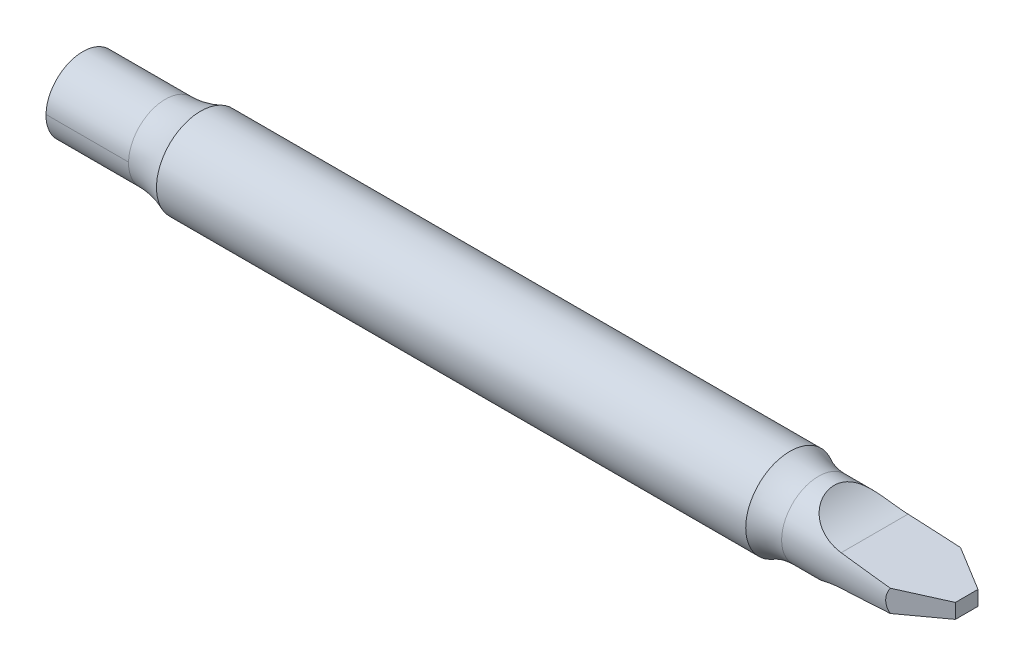
ISO-10303-21;
HEADER;
FILE_DESCRIPTION(('STEP AP214'),'2;1');
FILE_NAME('part.step','',(''),(''),'','','');
FILE_SCHEMA(('AUTOMOTIVE_DESIGN { 1 0 10303 214 1 1 1 1 }'));
ENDSEC;
DATA;
#1=APPLICATION_CONTEXT('core data for automotive mechanical design processes');
#2=APPLICATION_PROTOCOL_DEFINITION('international standard','automotive_design',2000,#1);
#3=PRODUCT_CONTEXT('',#1,'mechanical');
#4=PRODUCT('Part','Part','',(#3));
#5=PRODUCT_RELATED_PRODUCT_CATEGORY('part','',(#4));
#6=PRODUCT_DEFINITION_FORMATION('','',#4);
#7=PRODUCT_DEFINITION_CONTEXT('part definition',#1,'design');
#8=PRODUCT_DEFINITION('design','',#6,#7);
#9=PRODUCT_DEFINITION_SHAPE('','',#8);
#10=(LENGTH_UNIT() NAMED_UNIT(*) SI_UNIT(.MILLI.,.METRE.));
#11=(NAMED_UNIT(*) PLANE_ANGLE_UNIT() SI_UNIT($,.RADIAN.));
#12=(NAMED_UNIT(*) SI_UNIT($,.STERADIAN.) SOLID_ANGLE_UNIT());
#13=UNCERTAINTY_MEASURE_WITH_UNIT(LENGTH_MEASURE(1.E-05),#10,'distance_accuracy_value','');
#14=(GEOMETRIC_REPRESENTATION_CONTEXT(3) GLOBAL_UNCERTAINTY_ASSIGNED_CONTEXT((#13)) GLOBAL_UNIT_ASSIGNED_CONTEXT((#10,
#11,#12)) REPRESENTATION_CONTEXT('',''));
#15=CARTESIAN_POINT('',(0.,0.,0.));
#16=DIRECTION('',(0.,0.,1.));
#17=DIRECTION('',(1.,0.,0.));
#18=AXIS2_PLACEMENT_3D('',#15,#16,#17);
#19=CARTESIAN_POINT('',(50.8,0.,0.));
#20=DIRECTION('',(-1.,0.,0.));
#21=DIRECTION('',(0.,0.,1.));
#22=AXIS2_PLACEMENT_3D('',#19,#20,#21);
#23=CYLINDRICAL_SURFACE('',#22,15.875);
#24=CARTESIAN_POINT('',(35.5732349134821,0.,0.));
#25=DIRECTION('',(1.,0.,0.));
#26=DIRECTION('',(0.,0.,-1.));
#27=AXIS2_PLACEMENT_3D('',#24,#25,#26);
#28=CIRCLE('',#27,15.875);
#29=CARTESIAN_POINT('',(35.5732349134821,-0.333708294052789,-15.8714921722717));
#30=VERTEX_POINT('',#29);
#31=CARTESIAN_POINT('',(35.5732349134821,0.333708294052789,15.8714921722717));
#32=VERTEX_POINT('',#31);
#33=EDGE_CURVE('E336',#30,#32,#28,.F.);
#34=ORIENTED_EDGE('',*,*,#33,.T.);
#35=DIRECTION('',(-1.,0.,0.));
#36=VECTOR('',#35,1.);
#37=CARTESIAN_POINT('',(50.8,0.333708294052789,15.8714921722717));
#38=LINE('',#37,#36);
#39=CARTESIAN_POINT('',(0.,0.333708294052789,15.8714921722717));
#40=VERTEX_POINT('',#39);
#41=EDGE_CURVE('E11',#32,#40,#38,.T.);
#42=ORIENTED_EDGE('',*,*,#41,.T.);
#43=CARTESIAN_POINT('',(0.,0.,0.));
#44=DIRECTION('',(1.,0.,0.));
#45=DIRECTION('',(0.,0.,-1.));
#46=AXIS2_PLACEMENT_3D('',#43,#44,#45);
#47=CIRCLE('',#46,15.875);
#48=CARTESIAN_POINT('',(0.,-0.333708294052789,-15.8714921722717));
#49=VERTEX_POINT('',#48);
#50=EDGE_CURVE('E324',#40,#49,#47,.T.);
#51=ORIENTED_EDGE('',*,*,#50,.T.);
#52=DIRECTION('',(1.,0.,0.));
#53=VECTOR('',#52,1.);
#54=CARTESIAN_POINT('',(50.8,-0.333708294052789,-15.8714921722717));
#55=LINE('',#54,#53);
#56=EDGE_CURVE('E50',#49,#30,#55,.T.);
#57=ORIENTED_EDGE('',*,*,#56,.T.);
#58=EDGE_LOOP('',(#34,#42,#51,#57));
#59=FACE_BOUND('',#58,.T.);
#60=ADVANCED_FACE('F41',(#59),#23,.T.);
#61=CARTESIAN_POINT('',(381.,0.,0.));
#62=DIRECTION('',(-1.,0.,0.));
#63=DIRECTION('',(0.,0.,1.));
#64=AXIS2_PLACEMENT_3D('',#61,#62,#63);
#65=CYLINDRICAL_SURFACE('',#64,15.875);
#66=CARTESIAN_POINT('',(317.096722124209,0.,0.));
#67=DIRECTION('',(-1.,0.,0.));
#68=DIRECTION('',(0.,0.,1.));
#69=AXIS2_PLACEMENT_3D('',#66,#67,#68);
#70=CIRCLE('',#69,15.875);
#71=CARTESIAN_POINT('',(317.096722124209,0.,15.875));
#72=VERTEX_POINT('',#71);
#73=EDGE_CURVE('E332',#72,#72,#70,.F.);
#74=ORIENTED_EDGE('',*,*,#73,.T.);
#75=EDGE_LOOP('',(#74));
#76=FACE_BOUND('',#75,.T.);
#77=CARTESIAN_POINT('',(417.29041606127,0.,0.));
#78=DIRECTION('',(0.0871557427476514,-0.996194698091746,0.));
#79=DIRECTION('',(-0.996194698091746,-0.0871557427476514,0.));
#80=AXIS2_PLACEMENT_3D('',#77,#78,#79);
#81=ELLIPSE('',#80,182.145197775023,15.875);
#82=CARTESIAN_POINT('',(363.200103182754,-4.73228918344011,15.1532525909224));
#83=VERTEX_POINT('',#82);
#84=CARTESIAN_POINT('',(341.301045637678,-6.64820846053596,14.415857562603));
#85=VERTEX_POINT('',#84);
#86=EDGE_CURVE('E354',#83,#85,#81,.T.);
#87=ORIENTED_EDGE('',*,*,#86,.F.);
#88=CARTESIAN_POINT('',(389.446306570156,0.,0.));
#89=DIRECTION('',(0.500000000000001,0.,0.866025403784438));
#90=DIRECTION('',(-0.866025403784438,0.,0.500000000000001));
#91=AXIS2_PLACEMENT_3D('',#88,#89,#90);
#92=ELLIPSE('',#91,31.75,15.875);
#93=CARTESIAN_POINT('',(363.200103182754,4.7322891834401,15.1532525909224));
#94=VERTEX_POINT('',#93);
#95=EDGE_CURVE('E109',#94,#83,#92,.T.);
#96=ORIENTED_EDGE('',*,*,#95,.F.);
#97=CARTESIAN_POINT('',(417.29041606127,0.,0.));
#98=DIRECTION('',(-0.0871557427476514,-0.996194698091746,0.));
#99=DIRECTION('',(-0.996194698091746,0.0871557427476514,0.));
#100=AXIS2_PLACEMENT_3D('',#97,#98,#99);
#101=ELLIPSE('',#100,182.145197775023,15.875);
#102=CARTESIAN_POINT('',(341.301045637678,6.64820846053596,14.415857562603));
#103=VERTEX_POINT('',#102);
#104=EDGE_CURVE('E327',#94,#103,#101,.T.);
#105=ORIENTED_EDGE('',*,*,#104,.T.);
#106=CARTESIAN_POINT('',(341.301045637678,6.64820846053598,-14.415857562603));
#107=CARTESIAN_POINT('',(340.96585426801,6.67752555271307,-14.4023125632034));
#108=CARTESIAN_POINT('',(340.631365951051,6.71350888467094,-14.3856332988165));
#109=CARTESIAN_POINT('',(339.964447993741,6.79866342051561,-14.3455988297468));
#110=CARTESIAN_POINT('',(339.632018519139,6.84783567242023,-14.3222430945287));
#111=CARTESIAN_POINT('',(338.96942041066,6.95930350475444,-14.2684093568699));
#112=CARTESIAN_POINT('',(338.639255988396,7.0216189471409,-14.2379205672692));
#113=CARTESIAN_POINT('',(337.982423656747,7.15910804941623,-14.1692877054287));
#114=CARTESIAN_POINT('',(337.655755660829,7.23428139030023,-14.1311438231081));
#115=CARTESIAN_POINT('',(337.004322037944,7.39779160578233,-14.0462396649976));
#116=CARTESIAN_POINT('',(336.679586940008,7.48621917324546,-13.9994194538152));
#117=CARTESIAN_POINT('',(336.035226913864,7.67546032857261,-13.8965654666836));
#118=CARTESIAN_POINT('',(335.715601879022,7.77627365759242,-13.8405318832719));
#119=CARTESIAN_POINT('',(335.082536551454,7.98974263730328,-13.7184091376431));
#120=CARTESIAN_POINT('',(334.76909193182,8.10238962632645,-13.6523273146161));
#121=CARTESIAN_POINT('',(334.149107906996,8.33897467675626,-13.5091166797033));
#122=CARTESIAN_POINT('',(333.842567781773,8.46291155393806,-13.431989025958));
#123=CARTESIAN_POINT('',(333.122933296472,8.77021446105097,-13.2341931940068));
#124=CARTESIAN_POINT('',(332.713333430118,8.958343689893,-13.1080837414216));
#125=CARTESIAN_POINT('',(331.911765093273,9.35224061629534,-12.8300156949377));
#126=CARTESIAN_POINT('',(331.519795500643,9.55800718883872,-12.6780587491414));
#127=CARTESIAN_POINT('',(330.757847609357,9.98317432880578,-12.3460241730642));
#128=CARTESIAN_POINT('',(330.38779048177,10.202519377496,-12.166057017222));
#129=CARTESIAN_POINT('',(329.671126060267,10.6515223439992,-11.7749422091036));
#130=CARTESIAN_POINT('',(329.324514842732,10.8811785255118,-11.5637997928534));
#131=CARTESIAN_POINT('',(328.713490744598,11.3070416210665,-11.146293748315));
#132=CARTESIAN_POINT('',(328.44501913964,11.5024274173123,-10.9450240541935));
#133=CARTESIAN_POINT('',(327.928105591527,11.8936395474632,-10.5185858609698));
#134=CARTESIAN_POINT('',(327.679661607081,12.0894658343753,-10.2934198029079));
#135=CARTESIAN_POINT('',(327.204203900232,12.4780146333768,-9.81880044897978));
#136=CARTESIAN_POINT('',(326.977197825555,12.6707360176454,-9.56933854983532));
#137=CARTESIAN_POINT('',(326.54595234285,13.0491603579662,-9.04649961117948));
#138=CARTESIAN_POINT('',(326.341713288801,13.2348632048654,-8.77312219995068));
#139=CARTESIAN_POINT('',(325.956019061805,13.5961907189084,-8.20206697857917));
#140=CARTESIAN_POINT('',(325.774676015384,13.7717636624119,-7.90428052889597));
#141=CARTESIAN_POINT('',(325.436480553749,14.1080334852217,-7.28714504636995));
#142=CARTESIAN_POINT('',(325.279628610417,14.2687300778737,-6.967795598232));
#143=CARTESIAN_POINT('',(324.990662748405,14.5716764244544,-6.3097588746896));
#144=CARTESIAN_POINT('',(324.858547165897,14.7139274188822,-5.97107290190916));
#145=CARTESIAN_POINT('',(324.618996366529,14.9768603192128,-5.27702131429442));
#146=CARTESIAN_POINT('',(324.511559280123,15.0975438588288,-4.9216569654074));
#147=CARTESIAN_POINT('',(324.329614525446,15.305055638732,-4.22960368456941));
#148=CARTESIAN_POINT('',(324.253024503967,15.3939434353352,-3.89407604554677));
#149=CARTESIAN_POINT('',(324.119858959611,15.5501284507426,-3.21415264463917));
#150=CARTESIAN_POINT('',(324.063282172298,15.6174270335275,-2.86975744448182));
#151=CARTESIAN_POINT('',(323.96990199318,15.729278453018,-2.17470041927969));
#152=CARTESIAN_POINT('',(323.933096009397,15.7738342712915,-1.82403942192044));
#153=CARTESIAN_POINT('',(323.879056225239,15.8394675697269,-1.1190281458852));
#154=CARTESIAN_POINT('',(323.861822416852,15.8605450594991,-0.764677868719414));
#155=CARTESIAN_POINT('',(323.847019433624,15.8786426358669,-0.0639015403363864));
#156=CARTESIAN_POINT('',(323.848965726087,15.8762554959958,0.282499212780216));
#157=CARTESIAN_POINT('',(323.871374976521,15.8488798541519,0.973799722633571));
#158=CARTESIAN_POINT('',(323.891837496542,15.8238918867383,1.31869951467748));
#159=CARTESIAN_POINT('',(323.951383109707,15.7517129427969,2.00450370670047));
#160=CARTESIAN_POINT('',(323.990464023598,15.7045245648,2.34540856949609));
#161=CARTESIAN_POINT('',(324.087431817944,15.5886994116665,3.02084088041716));
#162=CARTESIAN_POINT('',(324.145318746494,15.5200625816778,3.35536831223075));
#163=CARTESIAN_POINT('',(324.280048019429,15.3625522094481,4.01528999128277));
#164=CARTESIAN_POINT('',(324.356867761065,15.2737028074463,4.340694617492));
#165=CARTESIAN_POINT('',(324.529721546533,15.0771990974941,4.98053135105462));
#166=CARTESIAN_POINT('',(324.625755431028,14.9695449454857,5.29496354937297));
#167=CARTESIAN_POINT('',(324.837189673825,14.7372731605022,5.91072509608736));
#168=CARTESIAN_POINT('',(324.952587617242,14.6126576431389,6.21205607243969));
#169=CARTESIAN_POINT('',(325.202806097271,14.3486026935095,6.79978083528842));
#170=CARTESIAN_POINT('',(325.337626765826,14.2091631605429,7.08617452029514));
#171=CARTESIAN_POINT('',(325.628239482362,13.9162013971768,7.64564076923822));
#172=CARTESIAN_POINT('',(325.784255615682,13.7625352036438,7.91852143455904));
#173=CARTESIAN_POINT('',(326.115699753435,13.4452340273348,8.44606818682005));
#174=CARTESIAN_POINT('',(326.291127764,13.2815990414096,8.70073426800598));
#175=CARTESIAN_POINT('',(326.660831254532,12.9471912934524,9.19096932808737));
#176=CARTESIAN_POINT('',(326.855107151753,12.7764183734486,9.42653788399007));
#177=CARTESIAN_POINT('',(327.261711910102,12.4305827788056,9.87811422150802));
#178=CARTESIAN_POINT('',(327.474041470555,12.2555199381794,10.0941212447195));
#179=CARTESIAN_POINT('',(327.929842046521,11.8926610864361,10.5196642456546));
#180=CARTESIAN_POINT('',(328.174435206256,11.7047643255995,10.7279115193515));
#181=CARTESIAN_POINT('',(328.681549051655,11.3303517298088,11.1226245913684));
#182=CARTESIAN_POINT('',(328.944070132912,11.1438359254271,11.3090899088078));
#183=CARTESIAN_POINT('',(329.485660489753,10.7749019527868,11.6611392988389));
#184=CARTESIAN_POINT('',(329.764736729763,10.592485554202,11.8267144904655));
#185=CARTESIAN_POINT('',(330.337811457401,10.2342512592491,12.1380415843354));
#186=CARTESIAN_POINT('',(330.631812894389,10.0584346791016,12.2837895474268));
#187=CARTESIAN_POINT('',(331.362432683348,9.64181325799987,12.6154404863488));
#188=CARTESIAN_POINT('',(331.806054072827,9.40554172891725,12.7916911848019));
#189=CARTESIAN_POINT('',(332.716331220804,8.95566041618044,13.110601298845));
#190=CARTESIAN_POINT('',(333.182995859038,8.7420594701005,13.2532476408305));
#191=CARTESIAN_POINT('',(334.136262166717,8.34072878452187,13.5094287146921));
#192=CARTESIAN_POINT('',(334.622904887933,8.15305617025574,13.6228996260884));
#193=CARTESIAN_POINT('',(335.611423076915,7.80676474861168,13.8242608140469));
#194=CARTESIAN_POINT('',(336.113295272915,7.64813975169285,13.9121565425912));
#195=CARTESIAN_POINT('',(337.002066867725,7.39750988779358,14.046610041489));
#196=CARTESIAN_POINT('',(337.38636393351,7.29876204824703,14.0980092287221));
#197=CARTESIAN_POINT('',(338.160402085377,7.11915123786207,14.1895547610646));
#198=CARTESIAN_POINT('',(338.550142557372,7.03828626665039,14.2297023649079));
#199=CARTESIAN_POINT('',(339.331725619304,6.89524104480691,14.2995688461868));
#200=CARTESIAN_POINT('',(339.723544990792,6.83296084488653,14.3293436592162));
#201=CARTESIAN_POINT('',(340.510265292402,6.72675391298804,14.3794813895839));
#202=CARTESIAN_POINT('',(340.90516623596,6.6828272610833,14.3998442658598));
#203=CARTESIAN_POINT('',(341.301045637678,6.64820846053597,14.415857562603));
#204=B_SPLINE_CURVE_WITH_KNOTS('',3,(#106,#107,#108,#109,#110,#111,#112,#113,#114,#115,#116,
#117,#118,#119,#120,#121,#122,#123,#124,#125,#126,#127,#128,#129,#130,#131,#132,#133,#134,#135,
#136,#137,#138,#139,#140,#141,#142,#143,#144,#145,#146,#147,#148,#149,#150,#151,#152,#153,#154,
#155,#156,#157,#158,#159,#160,#161,#162,#163,#164,#165,#166,#167,#168,#169,#170,#171,#172,#173,
#174,#175,#176,#177,#178,#179,#180,#181,#182,#183,#184,#185,#186,#187,#188,#189,#190,#191,#192,
#193,#194,#195,#196,#197,#198,#199,#200,#201,#202,#203),.UNSPECIFIED.,.F.,.F.,(4,2,2,2,2,2,2,2,
2,2,2,2,2,2,2,2,2,2,2,2,2,2,2,2,2,2,2,2,2,2,2,2,2,2,2,2,2,2,2,2,2,2,2,2,2,2,2,2,4),(0.,
1.01015937071764,2.02039903450198,3.03217645106471,4.04392876903898,5.06294999495135,
6.08194992843991,7.10020913250518,8.11836165151224,9.52115054467055,10.9238500259231,
12.321151153216,13.7182178638554,14.8819013250668,16.0454660289173,17.2094442653244,
18.3734405965939,19.5429327092079,20.7124473522228,21.8818833024837,23.0512306315573,
24.1162817513339,25.181265569194,26.2461097321892,27.3109534593122,28.3489671985226,
29.3869563870733,30.4248241104757,31.4626944881261,32.4993317661325,33.5359604480397,
34.5724599482811,35.608966489981,36.6574360526841,37.7059059466133,38.7543990568537,
39.8029327999532,40.9182584167632,42.0336086519889,43.1494314667957,44.2654756436785,
45.8610273158901,47.4571987080321,49.0568325346495,50.6561251095501,51.855847349717,
53.0554353212894,54.2484505329573,55.4414709494917),.UNSPECIFIED.);
#205=CARTESIAN_POINT('',(341.301045637678,6.64820846053596,-14.415857562603));
#206=VERTEX_POINT('',#205);
#207=EDGE_CURVE('E128',#206,#103,#204,.T.);
#208=ORIENTED_EDGE('',*,*,#207,.F.);
#209=CARTESIAN_POINT('',(363.200103182754,4.7322891834401,-15.1532525909224));
#210=VERTEX_POINT('',#209);
#211=EDGE_CURVE('E322',#206,#210,#101,.T.);
#212=ORIENTED_EDGE('',*,*,#211,.T.);
#213=CARTESIAN_POINT('',(389.446306570156,0.,0.));
#214=DIRECTION('',(-0.500000000000001,0.,0.866025403784438));
#215=DIRECTION('',(-0.866025403784438,0.,-0.500000000000001));
#216=AXIS2_PLACEMENT_3D('',#213,#214,#215);
#217=ELLIPSE('',#216,31.75,15.875);
#218=CARTESIAN_POINT('',(363.200103182754,-4.73228918344011,-15.1532525909224));
#219=VERTEX_POINT('',#218);
#220=EDGE_CURVE('E344',#210,#219,#217,.T.);
#221=ORIENTED_EDGE('',*,*,#220,.T.);
#222=CARTESIAN_POINT('',(341.301045637678,-6.64820846053596,-14.415857562603));
#223=VERTEX_POINT('',#222);
#224=EDGE_CURVE('E356',#223,#219,#81,.T.);
#225=ORIENTED_EDGE('',*,*,#224,.F.);
#226=CARTESIAN_POINT('',(341.301045637678,-6.64820846053598,-14.415857562603));
#227=CARTESIAN_POINT('',(340.96585426801,-6.67752555271308,-14.4023125632034));
#228=CARTESIAN_POINT('',(340.631365951051,-6.71350888467095,-14.3856332988165));
#229=CARTESIAN_POINT('',(339.964447993741,-6.79866342051561,-14.3455988297468));
#230=CARTESIAN_POINT('',(339.632018519139,-6.84783567242024,-14.3222430945287));
#231=CARTESIAN_POINT('',(338.96942041066,-6.95930350475443,-14.2684093568699));
#232=CARTESIAN_POINT('',(338.639255988396,-7.0216189471409,-14.2379205672692));
#233=CARTESIAN_POINT('',(337.982423656747,-7.15910804941622,-14.1692877054287));
#234=CARTESIAN_POINT('',(337.655755660829,-7.23428139030023,-14.1311438231081));
#235=CARTESIAN_POINT('',(337.004322037944,-7.39779160578233,-14.0462396649976));
#236=CARTESIAN_POINT('',(336.679586940008,-7.48621917324546,-13.9994194538152));
#237=CARTESIAN_POINT('',(336.035226913864,-7.67546032857261,-13.8965654666836));
#238=CARTESIAN_POINT('',(335.715601879022,-7.77627365759242,-13.8405318832719));
#239=CARTESIAN_POINT('',(335.082536551454,-7.98974263730329,-13.7184091376431));
#240=CARTESIAN_POINT('',(334.76909193182,-8.10238962632647,-13.6523273146161));
#241=CARTESIAN_POINT('',(334.149107906996,-8.33897467675628,-13.5091166797033));
#242=CARTESIAN_POINT('',(333.842567781773,-8.46291155393807,-13.431989025958));
#243=CARTESIAN_POINT('',(333.122933296472,-8.77021446105096,-13.2341931940068));
#244=CARTESIAN_POINT('',(332.713333430118,-8.958343689893,-13.1080837414216));
#245=CARTESIAN_POINT('',(331.911765093273,-9.35224061629533,-12.8300156949377));
#246=CARTESIAN_POINT('',(331.519795500643,-9.5580071888387,-12.6780587491414));
#247=CARTESIAN_POINT('',(330.757847609357,-9.98317432880575,-12.3460241730643));
#248=CARTESIAN_POINT('',(330.38779048177,-10.202519377496,-12.1660570172221));
#249=CARTESIAN_POINT('',(329.671126060267,-10.6515223439992,-11.7749422091036));
#250=CARTESIAN_POINT('',(329.324514842732,-10.8811785255118,-11.5637997928534));
#251=CARTESIAN_POINT('',(328.713490744598,-11.3070416210665,-11.146293748315));
#252=CARTESIAN_POINT('',(328.44501913964,-11.5024274173122,-10.9450240541935));
#253=CARTESIAN_POINT('',(327.928105591527,-11.8936395474632,-10.5185858609698));
#254=CARTESIAN_POINT('',(327.679661607081,-12.0894658343754,-10.2934198029079));
#255=CARTESIAN_POINT('',(327.204203900232,-12.4780146333769,-9.81880044897974));
#256=CARTESIAN_POINT('',(326.977197825555,-12.6707360176454,-9.5693385498353));
#257=CARTESIAN_POINT('',(326.54595234285,-13.0491603579662,-9.04649961117948));
#258=CARTESIAN_POINT('',(326.341713288801,-13.2348632048654,-8.77312219995068));
#259=CARTESIAN_POINT('',(325.956019061805,-13.5961907189084,-8.20206697857918));
#260=CARTESIAN_POINT('',(325.774676015384,-13.7717636624119,-7.90428052889599));
#261=CARTESIAN_POINT('',(325.436480553749,-14.1080334852217,-7.28714504636998));
#262=CARTESIAN_POINT('',(325.279628610417,-14.2687300778737,-6.96779559823201));
#263=CARTESIAN_POINT('',(324.990662748405,-14.5716764244544,-6.30975887468963));
#264=CARTESIAN_POINT('',(324.858547165897,-14.7139274188821,-5.9710729019092));
#265=CARTESIAN_POINT('',(324.618996366529,-14.9768603192128,-5.27702131429448));
#266=CARTESIAN_POINT('',(324.511559280123,-15.0975438588288,-4.92165696540745));
#267=CARTESIAN_POINT('',(324.329614525446,-15.305055638732,-4.22960368456946));
#268=CARTESIAN_POINT('',(324.253024503967,-15.3939434353352,-3.89407604554681));
#269=CARTESIAN_POINT('',(324.119858959611,-15.5501284507426,-3.2141526446392));
#270=CARTESIAN_POINT('',(324.063282172298,-15.6174270335275,-2.86975744448185));
#271=CARTESIAN_POINT('',(323.96990199318,-15.729278453018,-2.1747004192797));
#272=CARTESIAN_POINT('',(323.933096009397,-15.7738342712915,-1.82403942192045));
#273=CARTESIAN_POINT('',(323.879056225239,-15.8394675697269,-1.11902814588521));
#274=CARTESIAN_POINT('',(323.861822416852,-15.8605450594991,-0.764677868719415));
#275=CARTESIAN_POINT('',(323.847019433624,-15.8786426358669,-0.0639015403363853));
#276=CARTESIAN_POINT('',(323.848965726087,-15.8762554959958,0.282499212780216));
#277=CARTESIAN_POINT('',(323.871374976521,-15.8488798541519,0.973799722633569));
#278=CARTESIAN_POINT('',(323.891837496542,-15.8238918867383,1.31869951467747));
#279=CARTESIAN_POINT('',(323.951383109707,-15.7517129427969,2.00450370670047));
#280=CARTESIAN_POINT('',(323.990464023598,-15.7045245648,2.34540856949608));
#281=CARTESIAN_POINT('',(324.087431817944,-15.5886994116665,3.02084088041715));
#282=CARTESIAN_POINT('',(324.145318746494,-15.5200625816778,3.35536831223075));
#283=CARTESIAN_POINT('',(324.280048019429,-15.3625522094481,4.01528999128276));
#284=CARTESIAN_POINT('',(324.356867761065,-15.2737028074463,4.34069461749199));
#285=CARTESIAN_POINT('',(324.529721546533,-15.0771990974941,4.98053135105461));
#286=CARTESIAN_POINT('',(324.625755431028,-14.9695449454857,5.29496354937297));
#287=CARTESIAN_POINT('',(324.837189673825,-14.7372731605022,5.91072509608737));
#288=CARTESIAN_POINT('',(324.952587617242,-14.6126576431389,6.21205607243969));
#289=CARTESIAN_POINT('',(325.202806097271,-14.3486026935095,6.79978083528842));
#290=CARTESIAN_POINT('',(325.337626765826,-14.2091631605429,7.08617452029514));
#291=CARTESIAN_POINT('',(325.628239482362,-13.9162013971768,7.64564076923822));
#292=CARTESIAN_POINT('',(325.784255615682,-13.7625352036438,7.91852143455904));
#293=CARTESIAN_POINT('',(326.115699753435,-13.4452340273348,8.44606818682005));
#294=CARTESIAN_POINT('',(326.291127764,-13.2815990414096,8.70073426800597));
#295=CARTESIAN_POINT('',(326.660831254532,-12.9471912934525,9.19096932808736));
#296=CARTESIAN_POINT('',(326.855107151753,-12.7764183734486,9.42653788399006));
#297=CARTESIAN_POINT('',(327.261711910102,-12.4305827788056,9.87811422150801));
#298=CARTESIAN_POINT('',(327.474041470555,-12.2555199381795,10.0941212447195));
#299=CARTESIAN_POINT('',(327.929842046521,-11.8926610864361,10.5196642456546));
#300=CARTESIAN_POINT('',(328.174435206256,-11.7047643255995,10.7279115193515));
#301=CARTESIAN_POINT('',(328.681549051655,-11.3303517298088,11.1226245913684));
#302=CARTESIAN_POINT('',(328.944070132912,-11.143835925427,11.3090899088078));
#303=CARTESIAN_POINT('',(329.485660489753,-10.7749019527868,11.6611392988389));
#304=CARTESIAN_POINT('',(329.764736729763,-10.592485554202,11.8267144904655));
#305=CARTESIAN_POINT('',(330.337811457401,-10.2342512592491,12.1380415843354));
#306=CARTESIAN_POINT('',(330.631812894389,-10.0584346791016,12.2837895474268));
#307=CARTESIAN_POINT('',(331.362432683348,-9.64181325799985,12.6154404863488));
#308=CARTESIAN_POINT('',(331.806054072827,-9.40554172891722,12.791691184802));
#309=CARTESIAN_POINT('',(332.716331220804,-8.95566041618041,13.110601298845));
#310=CARTESIAN_POINT('',(333.182995859038,-8.74205947010046,13.2532476408305));
#311=CARTESIAN_POINT('',(334.136262166717,-8.34072878452183,13.5094287146922));
#312=CARTESIAN_POINT('',(334.622904887933,-8.15305617025571,13.6228996260884));
#313=CARTESIAN_POINT('',(335.611423076915,-7.80676474861165,13.8242608140469));
#314=CARTESIAN_POINT('',(336.113295272915,-7.64813975169282,13.9121565425912));
#315=CARTESIAN_POINT('',(337.002066867725,-7.39750988779356,14.046610041489));
#316=CARTESIAN_POINT('',(337.38636393351,-7.29876204824701,14.0980092287221));
#317=CARTESIAN_POINT('',(338.160402085377,-7.11915123786206,14.1895547610646));
#318=CARTESIAN_POINT('',(338.550142557372,-7.03828626665039,14.2297023649079));
#319=CARTESIAN_POINT('',(339.331725619304,-6.8952410448069,14.2995688461868));
#320=CARTESIAN_POINT('',(339.723544990792,-6.83296084488653,14.3293436592162));
#321=CARTESIAN_POINT('',(340.510265292402,-6.72675391298804,14.3794813895839));
#322=CARTESIAN_POINT('',(340.90516623596,-6.6828272610833,14.3998442658598));
#323=CARTESIAN_POINT('',(341.301045637678,-6.64820846053597,14.415857562603));
#324=B_SPLINE_CURVE_WITH_KNOTS('',3,(#226,#227,#228,#229,#230,#231,#232,#233,#234,#235,#236,
#237,#238,#239,#240,#241,#242,#243,#244,#245,#246,#247,#248,#249,#250,#251,#252,#253,#254,#255,
#256,#257,#258,#259,#260,#261,#262,#263,#264,#265,#266,#267,#268,#269,#270,#271,#272,#273,#274,
#275,#276,#277,#278,#279,#280,#281,#282,#283,#284,#285,#286,#287,#288,#289,#290,#291,#292,#293,
#294,#295,#296,#297,#298,#299,#300,#301,#302,#303,#304,#305,#306,#307,#308,#309,#310,#311,#312,
#313,#314,#315,#316,#317,#318,#319,#320,#321,#322,#323),.UNSPECIFIED.,.F.,.F.,(4,2,2,2,2,2,2,2,
2,2,2,2,2,2,2,2,2,2,2,2,2,2,2,2,2,2,2,2,2,2,2,2,2,2,2,2,2,2,2,2,2,2,2,2,2,2,2,2,4),(0.,
1.01015937071759,2.02039903450198,3.03217645106465,4.04392876903898,5.06294999495135,
6.08194992843991,7.10020913250519,8.11836165151224,9.52115054467055,10.923850025923,
12.321151153216,13.7182178638554,14.8819013250668,16.0454660289174,17.2094442653244,
18.3734405965939,19.5429327092079,20.7124473522228,21.8818833024836,23.0512306315573,
24.1162817513339,25.181265569194,26.2461097321892,27.3109534593122,28.3489671985226,
29.3869563870733,30.4248241104757,31.4626944881261,32.4993317661325,33.5359604480397,
34.5724599482811,35.608966489981,36.6574360526841,37.7059059466133,38.7543990568537,
39.8029327999532,40.9182584167632,42.0336086519889,43.1494314667958,44.2654756436786,
45.8610273158902,47.4571987080322,49.0568325346497,50.6561251095502,51.8558473497171,
53.0554353212895,54.2484505329573,55.4414709494917),.UNSPECIFIED.);
#325=EDGE_CURVE('E127',#223,#85,#324,.T.);
#326=ORIENTED_EDGE('',*,*,#325,.T.);
#327=EDGE_LOOP('',(#87,#96,#105,#208,#212,#221,#225,#326));
#328=FACE_BOUND('',#327,.T.);
#329=ADVANCED_FACE('F147',(#76,#328),#65,.T.);
#330=CARTESIAN_POINT('',(381.,0.,0.));
#331=DIRECTION('',(1.,0.,0.));
#332=DIRECTION('',(0.,0.,-1.));
#333=AXIS2_PLACEMENT_3D('',#330,#331,#332);
#334=PLANE('',#333);
#335=DIRECTION('',(0.,0.,-1.));
#336=VECTOR('',#335,1.);
#337=CARTESIAN_POINT('',(381.,3.175,0.));
#338=LINE('',#337,#336);
#339=CARTESIAN_POINT('',(381.,3.17499999999998,4.87647737193757));
#340=VERTEX_POINT('',#339);
#341=CARTESIAN_POINT('',(381.,3.17499999999999,-4.87647737193756));
#342=VERTEX_POINT('',#341);
#343=EDGE_CURVE('E121',#340,#342,#338,.T.);
#344=ORIENTED_EDGE('',*,*,#343,.F.);
#345=DIRECTION('',(0.,1.,0.));
#346=VECTOR('',#345,1.);
#347=CARTESIAN_POINT('',(381.,-38.1,4.87647737193757));
#348=LINE('',#347,#346);
#349=CARTESIAN_POINT('',(381.,-3.175,4.87647737193757));
#350=VERTEX_POINT('',#349);
#351=EDGE_CURVE('E106',#350,#340,#348,.T.);
#352=ORIENTED_EDGE('',*,*,#351,.F.);
#353=DIRECTION('',(0.,0.,-1.));
#354=VECTOR('',#353,1.);
#355=CARTESIAN_POINT('',(381.,-3.175,0.));
#356=LINE('',#355,#354);
#357=CARTESIAN_POINT('',(381.,-3.175,-4.87647737193763));
#358=VERTEX_POINT('',#357);
#359=EDGE_CURVE('E119',#350,#358,#356,.T.);
#360=ORIENTED_EDGE('',*,*,#359,.T.);
#361=DIRECTION('',(0.,1.,0.));
#362=VECTOR('',#361,1.);
#363=CARTESIAN_POINT('',(381.,-38.1,-4.87647737193757));
#364=LINE('',#363,#362);
#365=EDGE_CURVE('E343',#358,#342,#364,.T.);
#366=ORIENTED_EDGE('',*,*,#365,.T.);
#367=EDGE_LOOP('',(#344,#352,#360,#366));
#368=FACE_BOUND('',#367,.T.);
#369=ADVANCED_FACE('F117',(#368),#334,.T.);
#370=CARTESIAN_POINT('',(341.301045637678,6.64820846053596,-38.1));
#371=DIRECTION('',(-0.0871557427476514,-0.996194698091746,0.));
#372=DIRECTION('',(0.996194698091746,-0.0871557427476514,0.));
#373=AXIS2_PLACEMENT_3D('',#370,#371,#372);
#374=PLANE('',#373);
#375=DIRECTION('',(-0.863550259614423,0.0755508581011247,0.498570974847159));
#376=VECTOR('',#375,1.);
#377=CARTESIAN_POINT('',(369.672274110557,4.16604759885528,11.4165429635137));
#378=LINE('',#377,#376);
#379=EDGE_CURVE('E342',#340,#94,#378,.T.);
#380=ORIENTED_EDGE('',*,*,#379,.F.);
#381=ORIENTED_EDGE('',*,*,#343,.T.);
#382=DIRECTION('',(-0.863550259614423,0.0755508581011247,-0.498570974847159));
#383=VECTOR('',#382,1.);
#384=CARTESIAN_POINT('',(336.865042689428,7.03630842987538,-30.3578068558693));
#385=LINE('',#384,#383);
#386=EDGE_CURVE('E340',#342,#210,#385,.T.);
#387=ORIENTED_EDGE('',*,*,#386,.T.);
#388=ORIENTED_EDGE('',*,*,#211,.F.);
#389=DIRECTION('',(0.,0.,1.));
#390=VECTOR('',#389,1.);
#391=CARTESIAN_POINT('',(341.301045637678,6.64820846053596,-38.1));
#392=LINE('',#391,#390);
#393=EDGE_CURVE('E357',#206,#103,#392,.T.);
#394=ORIENTED_EDGE('',*,*,#393,.T.);
#395=ORIENTED_EDGE('',*,*,#104,.F.);
#396=EDGE_LOOP('',(#380,#381,#387,#388,#394,#395));
#397=FACE_BOUND('',#396,.T.);
#398=ADVANCED_FACE('F160',(#397),#374,.F.);
#399=CARTESIAN_POINT('',(341.301045637678,-6.64820846053596,-38.1));
#400=DIRECTION('',(0.0871557427476514,-0.996194698091746,0.));
#401=DIRECTION('',(0.996194698091746,0.0871557427476514,0.));
#402=AXIS2_PLACEMENT_3D('',#399,#400,#401);
#403=PLANE('',#402);
#404=ORIENTED_EDGE('',*,*,#359,.F.);
#405=DIRECTION('',(-0.863550259614423,-0.0755508581011247,0.498570974847159));
#406=VECTOR('',#405,1.);
#407=CARTESIAN_POINT('',(369.672274110557,-4.16604759885528,11.4165429635137));
#408=LINE('',#407,#406);
#409=EDGE_CURVE('E103',#350,#83,#408,.T.);
#410=ORIENTED_EDGE('',*,*,#409,.T.);
#411=ORIENTED_EDGE('',*,*,#86,.T.);
#412=DIRECTION('',(0.,0.,1.));
#413=VECTOR('',#412,1.);
#414=CARTESIAN_POINT('',(341.301045637678,-6.64820846053596,-38.1));
#415=LINE('',#414,#413);
#416=EDGE_CURVE('E345',#223,#85,#415,.T.);
#417=ORIENTED_EDGE('',*,*,#416,.F.);
#418=ORIENTED_EDGE('',*,*,#224,.T.);
#419=DIRECTION('',(-0.863550259614423,-0.0755508581011247,-0.498570974847159));
#420=VECTOR('',#419,1.);
#421=CARTESIAN_POINT('',(336.865042689428,-7.03630842987538,-30.3578068558693));
#422=LINE('',#421,#420);
#423=EDGE_CURVE('E113',#358,#219,#422,.T.);
#424=ORIENTED_EDGE('',*,*,#423,.F.);
#425=EDGE_LOOP('',(#404,#410,#411,#417,#418,#424));
#426=FACE_BOUND('',#425,.T.);
#427=ADVANCED_FACE('F124',(#426),#403,.T.);
#428=ORIENTED_EDGE('',*,*,#41,.F.);
#429=EDGE_CURVE('E335',#32,#30,#28,.F.);
#430=ORIENTED_EDGE('',*,*,#429,.T.);
#431=ORIENTED_EDGE('',*,*,#56,.F.);
#432=EDGE_CURVE('E330',#49,#40,#47,.T.);
#433=ORIENTED_EDGE('',*,*,#432,.T.);
#434=EDGE_LOOP('',(#428,#430,#431,#433));
#435=FACE_BOUND('',#434,.T.);
#436=ADVANCED_FACE('F173',(#435),#23,.T.);
#437=CARTESIAN_POINT('',(0.,0.,0.));
#438=DIRECTION('',(1.,0.,0.));
#439=DIRECTION('',(0.,0.,-1.));
#440=AXIS2_PLACEMENT_3D('',#437,#438,#439);
#441=PLANE('',#440);
#442=ORIENTED_EDGE('',*,*,#432,.F.);
#443=ORIENTED_EDGE('',*,*,#50,.F.);
#444=EDGE_LOOP('',(#442,#443));
#445=FACE_BOUND('',#444,.T.);
#446=ADVANCED_FACE('F178',(#445),#441,.F.);
#447=CARTESIAN_POINT('',(304.8,0.,0.));
#448=DIRECTION('',(-1.,0.,0.));
#449=DIRECTION('',(0.,0.,1.));
#450=AXIS2_PLACEMENT_3D('',#447,#448,#449);
#451=CYLINDRICAL_SURFACE('',#450,19.05);
#452=CARTESIAN_POINT('',(304.8,0.,0.));
#453=DIRECTION('',(1.,0.,0.));
#454=DIRECTION('',(0.,0.,-1.));
#455=AXIS2_PLACEMENT_3D('',#452,#453,#454);
#456=CIRCLE('',#455,19.05);
#457=CARTESIAN_POINT('',(304.8,0.,-19.05));
#458=VERTEX_POINT('',#457);
#459=EDGE_CURVE('E317',#458,#458,#456,.T.);
#460=ORIENTED_EDGE('',*,*,#459,.F.);
#461=EDGE_LOOP('',(#460));
#462=FACE_BOUND('',#461,.T.);
#463=CARTESIAN_POINT('',(50.8,0.,0.));
#464=DIRECTION('',(1.,0.,0.));
#465=DIRECTION('',(0.,0.,-1.));
#466=AXIS2_PLACEMENT_3D('',#463,#464,#465);
#467=CIRCLE('',#466,19.05);
#468=CARTESIAN_POINT('',(50.8,0.,-19.05));
#469=VERTEX_POINT('',#468);
#470=EDGE_CURVE('E320',#469,#469,#467,.T.);
#471=ORIENTED_EDGE('',*,*,#470,.T.);
#472=EDGE_LOOP('',(#471));
#473=FACE_BOUND('',#472,.T.);
#474=ADVANCED_FACE('F183',(#462,#473),#451,.T.);
#475=CARTESIAN_POINT('',(317.096722124209,0.,0.));
#476=DIRECTION('',(-1.,0.,0.));
#477=DIRECTION('',(0.,0.,1.));
#478=AXIS2_PLACEMENT_3D('',#475,#476,#477);
#479=TOROIDAL_SURFACE('',#478,41.275,25.4);
#480=ORIENTED_EDGE('',*,*,#459,.T.);
#481=EDGE_LOOP('',(#480));
#482=FACE_BOUND('',#481,.T.);
#483=ORIENTED_EDGE('',*,*,#73,.F.);
#484=EDGE_LOOP('',(#483));
#485=FACE_BOUND('',#484,.T.);
#486=ADVANCED_FACE('F241',(#482,#485),#479,.F.);
#487=CARTESIAN_POINT('',(35.5732349134821,0.,0.));
#488=DIRECTION('',(1.,0.,0.));
#489=DIRECTION('',(0.,0.,-1.));
#490=AXIS2_PLACEMENT_3D('',#487,#488,#489);
#491=TOROIDAL_SURFACE('',#490,53.975,38.1);
#492=ORIENTED_EDGE('',*,*,#33,.F.);
#493=ORIENTED_EDGE('',*,*,#429,.F.);
#494=EDGE_LOOP('',(#492,#493));
#495=FACE_BOUND('',#494,.T.);
#496=ORIENTED_EDGE('',*,*,#470,.F.);
#497=EDGE_LOOP('',(#496));
#498=FACE_BOUND('',#497,.T.);
#499=ADVANCED_FACE('F43',(#495,#498),#491,.F.);
#500=CARTESIAN_POINT('',(343.514801503468,31.9515537920663,-38.1));
#501=DIRECTION('',(0.,0.,1.));
#502=DIRECTION('',(1.,0.,0.));
#503=AXIS2_PLACEMENT_3D('',#500,#501,#502);
#504=CYLINDRICAL_SURFACE('',#503,25.4);
#505=ORIENTED_EDGE('',*,*,#393,.F.);
#506=ORIENTED_EDGE('',*,*,#207,.T.);
#507=EDGE_LOOP('',(#505,#506));
#508=FACE_BOUND('',#507,.T.);
#509=ADVANCED_FACE('F157',(#508),#504,.F.);
#510=CARTESIAN_POINT('',(343.514801503468,-31.9515537920663,-38.1));
#511=DIRECTION('',(0.,0.,1.));
#512=DIRECTION('',(1.,0.,0.));
#513=AXIS2_PLACEMENT_3D('',#510,#511,#512);
#514=CYLINDRICAL_SURFACE('',#513,25.4);
#515=ORIENTED_EDGE('',*,*,#416,.T.);
#516=ORIENTED_EDGE('',*,*,#325,.F.);
#517=EDGE_LOOP('',(#515,#516));
#518=FACE_BOUND('',#517,.T.);
#519=ADVANCED_FACE('F151',(#518),#514,.F.);
#520=CARTESIAN_POINT('',(361.95,-38.1,-15.875));
#521=DIRECTION('',(-0.500000000000001,0.,0.866025403784438));
#522=DIRECTION('',(0.866025403784438,0.,0.500000000000001));
#523=AXIS2_PLACEMENT_3D('',#520,#521,#522);
#524=PLANE('',#523);
#525=ORIENTED_EDGE('',*,*,#365,.F.);
#526=ORIENTED_EDGE('',*,*,#423,.T.);
#527=ORIENTED_EDGE('',*,*,#220,.F.);
#528=ORIENTED_EDGE('',*,*,#386,.F.);
#529=EDGE_LOOP('',(#525,#526,#527,#528));
#530=FACE_BOUND('',#529,.T.);
#531=ADVANCED_FACE('F156',(#530),#524,.F.);
#532=CARTESIAN_POINT('',(361.95,-38.1,15.875));
#533=DIRECTION('',(0.500000000000001,0.,0.866025403784438));
#534=DIRECTION('',(0.866025403784438,0.,-0.500000000000001));
#535=AXIS2_PLACEMENT_3D('',#532,#533,#534);
#536=PLANE('',#535);
#537=ORIENTED_EDGE('',*,*,#379,.T.);
#538=ORIENTED_EDGE('',*,*,#95,.T.);
#539=ORIENTED_EDGE('',*,*,#409,.F.);
#540=ORIENTED_EDGE('',*,*,#351,.T.);
#541=EDGE_LOOP('',(#537,#538,#539,#540));
#542=FACE_BOUND('',#541,.T.);
#543=ADVANCED_FACE('F105',(#542),#536,.T.);
#544=CLOSED_SHELL('',(#60,#329,#369,#398,#427,#436,#446,#474,#486,#499,#509,#519,#531,#543));
#545=MANIFOLD_SOLID_BREP('B2',#544);
#546=ADVANCED_BREP_SHAPE_REPRESENTATION('',(#18,#545),#14);
#547=SHAPE_DEFINITION_REPRESENTATION(#9,#546);
ENDSEC;
END-ISO-10303-21;
